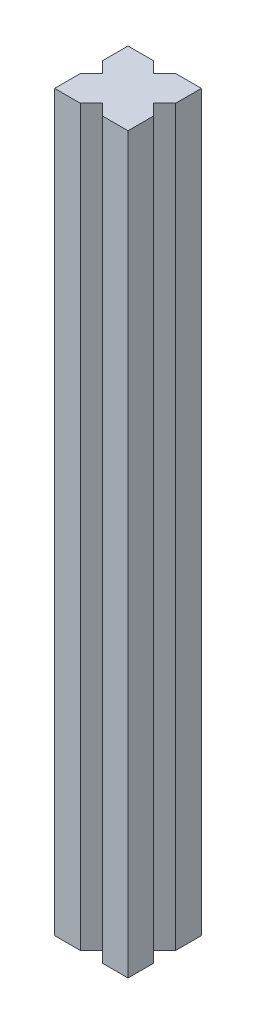
ISO-10303-21;
HEADER;
FILE_DESCRIPTION(('STEP AP214'),'2;1');
FILE_NAME('part.step','',(''),(''),'','','');
FILE_SCHEMA(('AUTOMOTIVE_DESIGN { 1 0 10303 214 1 1 1 1 }'));
ENDSEC;
DATA;
#1=APPLICATION_CONTEXT('core data for automotive mechanical design processes');
#2=APPLICATION_PROTOCOL_DEFINITION('international standard','automotive_design',2000,#1);
#3=PRODUCT_CONTEXT('',#1,'mechanical');
#4=PRODUCT('Part','Part','',(#3));
#5=PRODUCT_RELATED_PRODUCT_CATEGORY('part','',(#4));
#6=PRODUCT_DEFINITION_FORMATION('','',#4);
#7=PRODUCT_DEFINITION_CONTEXT('part definition',#1,'design');
#8=PRODUCT_DEFINITION('design','',#6,#7);
#9=PRODUCT_DEFINITION_SHAPE('','',#8);
#10=(LENGTH_UNIT() NAMED_UNIT(*) SI_UNIT(.MILLI.,.METRE.));
#11=(NAMED_UNIT(*) PLANE_ANGLE_UNIT() SI_UNIT($,.RADIAN.));
#12=(NAMED_UNIT(*) SI_UNIT($,.STERADIAN.) SOLID_ANGLE_UNIT());
#13=UNCERTAINTY_MEASURE_WITH_UNIT(LENGTH_MEASURE(1.E-05),#10,'distance_accuracy_value','');
#14=(GEOMETRIC_REPRESENTATION_CONTEXT(3) GLOBAL_UNCERTAINTY_ASSIGNED_CONTEXT((#13)) GLOBAL_UNIT_ASSIGNED_CONTEXT((#10,
#11,#12)) REPRESENTATION_CONTEXT('',''));
#15=CARTESIAN_POINT('',(0.,0.,0.));
#16=DIRECTION('',(0.,0.,1.));
#17=DIRECTION('',(1.,0.,0.));
#18=AXIS2_PLACEMENT_3D('',#15,#16,#17);
#19=CARTESIAN_POINT('',(0.,200.,0.));
#20=DIRECTION('',(1.,0.,0.));
#21=DIRECTION('',(0.,0.,-1.));
#22=AXIS2_PLACEMENT_3D('',#19,#20,#21);
#23=PLANE('',#22);
#24=DIRECTION('',(0.,0.,1.));
#25=VECTOR('',#24,1.);
#26=CARTESIAN_POINT('',(0.,200.,0.));
#27=LINE('',#26,#25);
#28=CARTESIAN_POINT('',(0.,200.,-7.));
#29=VERTEX_POINT('',#28);
#30=CARTESIAN_POINT('',(0.,200.,0.));
#31=VERTEX_POINT('',#30);
#32=EDGE_CURVE('E188',#29,#31,#27,.T.);
#33=ORIENTED_EDGE('',*,*,#32,.F.);
#34=DIRECTION('',(0.,1.,0.));
#35=VECTOR('',#34,1.);
#36=CARTESIAN_POINT('',(0.,0.,-7.));
#37=LINE('',#36,#35);
#38=CARTESIAN_POINT('',(0.,0.,-7.));
#39=VERTEX_POINT('',#38);
#40=EDGE_CURVE('E239',#39,#29,#37,.T.);
#41=ORIENTED_EDGE('',*,*,#40,.F.);
#42=DIRECTION('',(0.,0.,1.));
#43=VECTOR('',#42,1.);
#44=CARTESIAN_POINT('',(0.,0.,0.));
#45=LINE('',#44,#43);
#46=CARTESIAN_POINT('',(0.,0.,0.));
#47=VERTEX_POINT('',#46);
#48=EDGE_CURVE('E309',#39,#47,#45,.T.);
#49=ORIENTED_EDGE('',*,*,#48,.T.);
#50=DIRECTION('',(0.,-1.,0.));
#51=VECTOR('',#50,1.);
#52=CARTESIAN_POINT('',(0.,200.,0.));
#53=LINE('',#52,#51);
#54=EDGE_CURVE('E11',#31,#47,#53,.T.);
#55=ORIENTED_EDGE('',*,*,#54,.F.);
#56=EDGE_LOOP('',(#33,#41,#49,#55));
#57=FACE_BOUND('',#56,.T.);
#58=ADVANCED_FACE('F40',(#57),#23,.F.);
#59=CARTESIAN_POINT('',(0.,200.,0.));
#60=DIRECTION('',(0.,0.,-1.));
#61=DIRECTION('',(-1.,0.,0.));
#62=AXIS2_PLACEMENT_3D('',#59,#60,#61);
#63=PLANE('',#62);
#64=DIRECTION('',(1.,0.,0.));
#65=VECTOR('',#64,1.);
#66=CARTESIAN_POINT('',(0.,0.,0.));
#67=LINE('',#66,#65);
#68=CARTESIAN_POINT('',(7.,0.,0.));
#69=VERTEX_POINT('',#68);
#70=EDGE_CURVE('E310',#47,#69,#67,.T.);
#71=ORIENTED_EDGE('',*,*,#70,.T.);
#72=DIRECTION('',(0.,1.,0.));
#73=VECTOR('',#72,1.);
#74=CARTESIAN_POINT('',(7.,0.,0.));
#75=LINE('',#74,#73);
#76=CARTESIAN_POINT('',(7.,200.,0.));
#77=VERTEX_POINT('',#76);
#78=EDGE_CURVE('E279',#69,#77,#75,.T.);
#79=ORIENTED_EDGE('',*,*,#78,.T.);
#80=DIRECTION('',(1.,0.,0.));
#81=VECTOR('',#80,1.);
#82=CARTESIAN_POINT('',(0.,200.,0.));
#83=LINE('',#82,#81);
#84=EDGE_CURVE('E298',#31,#77,#83,.T.);
#85=ORIENTED_EDGE('',*,*,#84,.F.);
#86=ORIENTED_EDGE('',*,*,#54,.T.);
#87=EDGE_LOOP('',(#71,#79,#85,#86));
#88=FACE_BOUND('',#87,.T.);
#89=ADVANCED_FACE('F332',(#88),#63,.F.);
#90=CARTESIAN_POINT('',(20.,200.,0.));
#91=DIRECTION('',(-1.,0.,0.));
#92=DIRECTION('',(0.,0.,1.));
#93=AXIS2_PLACEMENT_3D('',#90,#91,#92);
#94=PLANE('',#93);
#95=DIRECTION('',(0.,0.,-1.));
#96=VECTOR('',#95,1.);
#97=CARTESIAN_POINT('',(20.,0.,0.));
#98=LINE('',#97,#96);
#99=CARTESIAN_POINT('',(20.,0.,0.));
#100=VERTEX_POINT('',#99);
#101=CARTESIAN_POINT('',(20.,0.,-7.));
#102=VERTEX_POINT('',#101);
#103=EDGE_CURVE('E181',#100,#102,#98,.T.);
#104=ORIENTED_EDGE('',*,*,#103,.T.);
#105=DIRECTION('',(0.,1.,0.));
#106=VECTOR('',#105,1.);
#107=CARTESIAN_POINT('',(20.,0.,-7.));
#108=LINE('',#107,#106);
#109=CARTESIAN_POINT('',(20.,200.,-7.));
#110=VERTEX_POINT('',#109);
#111=EDGE_CURVE('E242',#102,#110,#108,.T.);
#112=ORIENTED_EDGE('',*,*,#111,.T.);
#113=DIRECTION('',(0.,0.,-1.));
#114=VECTOR('',#113,1.);
#115=CARTESIAN_POINT('',(20.,200.,0.));
#116=LINE('',#115,#114);
#117=CARTESIAN_POINT('',(20.,200.,0.));
#118=VERTEX_POINT('',#117);
#119=EDGE_CURVE('E214',#118,#110,#116,.T.);
#120=ORIENTED_EDGE('',*,*,#119,.F.);
#121=DIRECTION('',(0.,-1.,0.));
#122=VECTOR('',#121,1.);
#123=CARTESIAN_POINT('',(20.,200.,0.));
#124=LINE('',#123,#122);
#125=EDGE_CURVE('E49',#118,#100,#124,.T.);
#126=ORIENTED_EDGE('',*,*,#125,.T.);
#127=EDGE_LOOP('',(#104,#112,#120,#126));
#128=FACE_BOUND('',#127,.T.);
#129=ADVANCED_FACE('F211',(#128),#94,.F.);
#130=CARTESIAN_POINT('',(0.,200.,-20.));
#131=DIRECTION('',(0.,0.,1.));
#132=DIRECTION('',(1.,0.,0.));
#133=AXIS2_PLACEMENT_3D('',#130,#131,#132);
#134=PLANE('',#133);
#135=DIRECTION('',(-1.,0.,0.));
#136=VECTOR('',#135,1.);
#137=CARTESIAN_POINT('',(0.,0.,-20.));
#138=LINE('',#137,#136);
#139=CARTESIAN_POINT('',(20.,0.,-20.));
#140=VERTEX_POINT('',#139);
#141=CARTESIAN_POINT('',(13.,0.,-20.));
#142=VERTEX_POINT('',#141);
#143=EDGE_CURVE('E180',#140,#142,#138,.T.);
#144=ORIENTED_EDGE('',*,*,#143,.T.);
#145=DIRECTION('',(0.,1.,0.));
#146=VECTOR('',#145,1.);
#147=CARTESIAN_POINT('',(13.,0.,-20.));
#148=LINE('',#147,#146);
#149=CARTESIAN_POINT('',(13.,200.,-20.));
#150=VERTEX_POINT('',#149);
#151=EDGE_CURVE('E339',#142,#150,#148,.T.);
#152=ORIENTED_EDGE('',*,*,#151,.T.);
#153=DIRECTION('',(-1.,0.,0.));
#154=VECTOR('',#153,1.);
#155=CARTESIAN_POINT('',(0.,200.,-20.));
#156=LINE('',#155,#154);
#157=CARTESIAN_POINT('',(20.,200.,-20.));
#158=VERTEX_POINT('',#157);
#159=EDGE_CURVE('E199',#158,#150,#156,.T.);
#160=ORIENTED_EDGE('',*,*,#159,.F.);
#161=DIRECTION('',(0.,-1.,0.));
#162=VECTOR('',#161,1.);
#163=CARTESIAN_POINT('',(20.,200.,-20.));
#164=LINE('',#163,#162);
#165=EDGE_CURVE('E198',#158,#140,#164,.T.);
#166=ORIENTED_EDGE('',*,*,#165,.T.);
#167=EDGE_LOOP('',(#144,#152,#160,#166));
#168=FACE_BOUND('',#167,.T.);
#169=ADVANCED_FACE('F355',(#168),#134,.F.);
#170=CARTESIAN_POINT('',(0.,0.,-20.));
#171=VERTEX_POINT('',#170);
#172=CARTESIAN_POINT('',(0.,0.,-13.));
#173=VERTEX_POINT('',#172);
#174=EDGE_CURVE('E178',#171,#173,#45,.T.);
#175=ORIENTED_EDGE('',*,*,#174,.T.);
#176=DIRECTION('',(0.,1.,0.));
#177=VECTOR('',#176,1.);
#178=CARTESIAN_POINT('',(0.,0.,-13.));
#179=LINE('',#178,#177);
#180=CARTESIAN_POINT('',(0.,200.,-13.));
#181=VERTEX_POINT('',#180);
#182=EDGE_CURVE('E266',#173,#181,#179,.T.);
#183=ORIENTED_EDGE('',*,*,#182,.T.);
#184=CARTESIAN_POINT('',(0.,200.,-20.));
#185=VERTEX_POINT('',#184);
#186=EDGE_CURVE('E293',#185,#181,#27,.T.);
#187=ORIENTED_EDGE('',*,*,#186,.F.);
#188=DIRECTION('',(0.,-1.,0.));
#189=VECTOR('',#188,1.);
#190=CARTESIAN_POINT('',(0.,200.,-20.));
#191=LINE('',#190,#189);
#192=EDGE_CURVE('E195',#185,#171,#191,.T.);
#193=ORIENTED_EDGE('',*,*,#192,.T.);
#194=EDGE_LOOP('',(#175,#183,#187,#193));
#195=FACE_BOUND('',#194,.T.);
#196=ADVANCED_FACE('F42',(#195),#23,.F.);
#197=CARTESIAN_POINT('',(13.,200.,0.));
#198=VERTEX_POINT('',#197);
#199=EDGE_CURVE('E297',#198,#118,#83,.T.);
#200=ORIENTED_EDGE('',*,*,#199,.F.);
#201=DIRECTION('',(0.,1.,0.));
#202=VECTOR('',#201,1.);
#203=CARTESIAN_POINT('',(13.,0.,0.));
#204=LINE('',#203,#202);
#205=CARTESIAN_POINT('',(13.,0.,0.));
#206=VERTEX_POINT('',#205);
#207=EDGE_CURVE('E287',#206,#198,#204,.T.);
#208=ORIENTED_EDGE('',*,*,#207,.F.);
#209=EDGE_CURVE('E219',#206,#100,#67,.T.);
#210=ORIENTED_EDGE('',*,*,#209,.T.);
#211=ORIENTED_EDGE('',*,*,#125,.F.);
#212=EDGE_LOOP('',(#200,#208,#210,#211));
#213=FACE_BOUND('',#212,.T.);
#214=ADVANCED_FACE('F321',(#213),#63,.F.);
#215=CARTESIAN_POINT('',(20.,200.,-13.));
#216=VERTEX_POINT('',#215);
#217=EDGE_CURVE('E302',#216,#158,#116,.T.);
#218=ORIENTED_EDGE('',*,*,#217,.F.);
#219=DIRECTION('',(0.,1.,0.));
#220=VECTOR('',#219,1.);
#221=CARTESIAN_POINT('',(20.,0.,-13.));
#222=LINE('',#221,#220);
#223=CARTESIAN_POINT('',(20.,0.,-13.));
#224=VERTEX_POINT('',#223);
#225=EDGE_CURVE('E224',#224,#216,#222,.T.);
#226=ORIENTED_EDGE('',*,*,#225,.F.);
#227=EDGE_CURVE('E191',#224,#140,#98,.T.);
#228=ORIENTED_EDGE('',*,*,#227,.T.);
#229=ORIENTED_EDGE('',*,*,#165,.F.);
#230=EDGE_LOOP('',(#218,#226,#228,#229));
#231=FACE_BOUND('',#230,.T.);
#232=ADVANCED_FACE('F359',(#231),#94,.F.);
#233=CARTESIAN_POINT('',(7.,200.,-20.));
#234=VERTEX_POINT('',#233);
#235=EDGE_CURVE('E171',#234,#185,#156,.T.);
#236=ORIENTED_EDGE('',*,*,#235,.F.);
#237=DIRECTION('',(0.,1.,0.));
#238=VECTOR('',#237,1.);
#239=CARTESIAN_POINT('',(7.,0.,-20.));
#240=LINE('',#239,#238);
#241=CARTESIAN_POINT('',(7.,0.,-20.));
#242=VERTEX_POINT('',#241);
#243=EDGE_CURVE('E157',#242,#234,#240,.T.);
#244=ORIENTED_EDGE('',*,*,#243,.F.);
#245=EDGE_CURVE('E169',#242,#171,#138,.T.);
#246=ORIENTED_EDGE('',*,*,#245,.T.);
#247=ORIENTED_EDGE('',*,*,#192,.F.);
#248=EDGE_LOOP('',(#236,#244,#246,#247));
#249=FACE_BOUND('',#248,.T.);
#250=ADVANCED_FACE('F167',(#249),#134,.F.);
#251=CARTESIAN_POINT('',(0.,200.,0.));
#252=DIRECTION('',(0.,-1.,0.));
#253=DIRECTION('',(0.,0.,-1.));
#254=AXIS2_PLACEMENT_3D('',#251,#252,#253);
#255=PLANE('',#254);
#256=ORIENTED_EDGE('',*,*,#159,.T.);
#257=DIRECTION('',(0.707106781186548,0.,-0.707106781186547));
#258=VECTOR('',#257,1.);
#259=CARTESIAN_POINT('',(13.,200.,-20.));
#260=LINE('',#259,#258);
#261=CARTESIAN_POINT('',(10.,200.,-17.));
#262=VERTEX_POINT('',#261);
#263=EDGE_CURVE('E163',#262,#150,#260,.T.);
#264=ORIENTED_EDGE('',*,*,#263,.F.);
#265=DIRECTION('',(0.707106781186548,0.,0.707106781186547));
#266=VECTOR('',#265,1.);
#267=CARTESIAN_POINT('',(7.,200.,-20.));
#268=LINE('',#267,#266);
#269=EDGE_CURVE('E245',#234,#262,#268,.T.);
#270=ORIENTED_EDGE('',*,*,#269,.F.);
#271=ORIENTED_EDGE('',*,*,#235,.T.);
#272=ORIENTED_EDGE('',*,*,#186,.T.);
#273=DIRECTION('',(-0.707106781186547,0.,-0.707106781186548));
#274=VECTOR('',#273,1.);
#275=CARTESIAN_POINT('',(0.,200.,-13.));
#276=LINE('',#275,#274);
#277=CARTESIAN_POINT('',(2.99999999999999,200.,-10.));
#278=VERTEX_POINT('',#277);
#279=EDGE_CURVE('E253',#278,#181,#276,.T.);
#280=ORIENTED_EDGE('',*,*,#279,.F.);
#281=DIRECTION('',(0.707106781186548,0.,-0.707106781186547));
#282=VECTOR('',#281,1.);
#283=CARTESIAN_POINT('',(0.,200.,-7.));
#284=LINE('',#283,#282);
#285=EDGE_CURVE('E257',#29,#278,#284,.T.);
#286=ORIENTED_EDGE('',*,*,#285,.F.);
#287=ORIENTED_EDGE('',*,*,#32,.T.);
#288=ORIENTED_EDGE('',*,*,#84,.T.);
#289=DIRECTION('',(-0.707106781186547,0.,0.707106781186548));
#290=VECTOR('',#289,1.);
#291=CARTESIAN_POINT('',(7.,200.,0.));
#292=LINE('',#291,#290);
#293=CARTESIAN_POINT('',(10.,200.,-3.));
#294=VERTEX_POINT('',#293);
#295=EDGE_CURVE('E280',#294,#77,#292,.T.);
#296=ORIENTED_EDGE('',*,*,#295,.F.);
#297=DIRECTION('',(-0.707106781186547,0.,-0.707106781186548));
#298=VECTOR('',#297,1.);
#299=CARTESIAN_POINT('',(13.,200.,0.));
#300=LINE('',#299,#298);
#301=EDGE_CURVE('E276',#198,#294,#300,.T.);
#302=ORIENTED_EDGE('',*,*,#301,.F.);
#303=ORIENTED_EDGE('',*,*,#199,.T.);
#304=ORIENTED_EDGE('',*,*,#119,.T.);
#305=DIRECTION('',(0.707106781186548,0.,0.707106781186547));
#306=VECTOR('',#305,1.);
#307=CARTESIAN_POINT('',(20.,200.,-7.));
#308=LINE('',#307,#306);
#309=CARTESIAN_POINT('',(17.,200.,-10.));
#310=VERTEX_POINT('',#309);
#311=EDGE_CURVE('E232',#310,#110,#308,.T.);
#312=ORIENTED_EDGE('',*,*,#311,.F.);
#313=DIRECTION('',(-0.707106781186547,0.,0.707106781186548));
#314=VECTOR('',#313,1.);
#315=CARTESIAN_POINT('',(20.,200.,-13.));
#316=LINE('',#315,#314);
#317=EDGE_CURVE('E235',#216,#310,#316,.T.);
#318=ORIENTED_EDGE('',*,*,#317,.F.);
#319=ORIENTED_EDGE('',*,*,#217,.T.);
#320=EDGE_LOOP('',(#256,#264,#270,#271,#272,#280,#286,#287,#288,#296,#302,#303,#304,#312,#318,#319));
#321=FACE_BOUND('',#320,.T.);
#322=ADVANCED_FACE('F328',(#321),#255,.F.);
#323=CARTESIAN_POINT('',(0.,0.,0.));
#324=DIRECTION('',(0.,-1.,0.));
#325=DIRECTION('',(0.,0.,-1.));
#326=AXIS2_PLACEMENT_3D('',#323,#324,#325);
#327=PLANE('',#326);
#328=DIRECTION('',(0.707106781186548,0.,-0.707106781186547));
#329=VECTOR('',#328,1.);
#330=CARTESIAN_POINT('',(13.,0.,-20.));
#331=LINE('',#330,#329);
#332=CARTESIAN_POINT('',(10.,0.,-17.));
#333=VERTEX_POINT('',#332);
#334=EDGE_CURVE('E56',#333,#142,#331,.T.);
#335=ORIENTED_EDGE('',*,*,#334,.T.);
#336=ORIENTED_EDGE('',*,*,#143,.F.);
#337=ORIENTED_EDGE('',*,*,#227,.F.);
#338=DIRECTION('',(-0.707106781186547,0.,0.707106781186548));
#339=VECTOR('',#338,1.);
#340=CARTESIAN_POINT('',(20.,0.,-13.));
#341=LINE('',#340,#339);
#342=CARTESIAN_POINT('',(17.,0.,-10.));
#343=VERTEX_POINT('',#342);
#344=EDGE_CURVE('E222',#224,#343,#341,.T.);
#345=ORIENTED_EDGE('',*,*,#344,.T.);
#346=DIRECTION('',(0.707106781186548,0.,0.707106781186547));
#347=VECTOR('',#346,1.);
#348=CARTESIAN_POINT('',(20.,0.,-7.));
#349=LINE('',#348,#347);
#350=EDGE_CURVE('E64',#343,#102,#349,.T.);
#351=ORIENTED_EDGE('',*,*,#350,.T.);
#352=ORIENTED_EDGE('',*,*,#103,.F.);
#353=ORIENTED_EDGE('',*,*,#209,.F.);
#354=DIRECTION('',(-0.707106781186547,0.,-0.707106781186548));
#355=VECTOR('',#354,1.);
#356=CARTESIAN_POINT('',(13.,0.,0.));
#357=LINE('',#356,#355);
#358=CARTESIAN_POINT('',(10.,0.,-3.));
#359=VERTEX_POINT('',#358);
#360=EDGE_CURVE('E275',#206,#359,#357,.T.);
#361=ORIENTED_EDGE('',*,*,#360,.T.);
#362=DIRECTION('',(-0.707106781186547,0.,0.707106781186548));
#363=VECTOR('',#362,1.);
#364=CARTESIAN_POINT('',(7.,0.,0.));
#365=LINE('',#364,#363);
#366=EDGE_CURVE('E271',#359,#69,#365,.T.);
#367=ORIENTED_EDGE('',*,*,#366,.T.);
#368=ORIENTED_EDGE('',*,*,#70,.F.);
#369=ORIENTED_EDGE('',*,*,#48,.F.);
#370=DIRECTION('',(0.707106781186548,0.,-0.707106781186547));
#371=VECTOR('',#370,1.);
#372=CARTESIAN_POINT('',(0.,0.,-7.));
#373=LINE('',#372,#371);
#374=CARTESIAN_POINT('',(2.99999999999999,0.,-10.));
#375=VERTEX_POINT('',#374);
#376=EDGE_CURVE('E248',#39,#375,#373,.T.);
#377=ORIENTED_EDGE('',*,*,#376,.T.);
#378=DIRECTION('',(-0.707106781186547,0.,-0.707106781186548));
#379=VECTOR('',#378,1.);
#380=CARTESIAN_POINT('',(0.,0.,-13.));
#381=LINE('',#380,#379);
#382=EDGE_CURVE('E252',#375,#173,#381,.T.);
#383=ORIENTED_EDGE('',*,*,#382,.T.);
#384=ORIENTED_EDGE('',*,*,#174,.F.);
#385=ORIENTED_EDGE('',*,*,#245,.F.);
#386=DIRECTION('',(0.707106781186548,0.,0.707106781186547));
#387=VECTOR('',#386,1.);
#388=CARTESIAN_POINT('',(7.,0.,-20.));
#389=LINE('',#388,#387);
#390=EDGE_CURVE('E153',#242,#333,#389,.T.);
#391=ORIENTED_EDGE('',*,*,#390,.T.);
#392=EDGE_LOOP('',(#335,#336,#337,#345,#351,#352,#353,#361,#367,#368,#369,#377,#383,#384,#385,#391));
#393=FACE_BOUND('',#392,.T.);
#394=ADVANCED_FACE('F175',(#393),#327,.T.);
#395=CARTESIAN_POINT('',(7.,0.,0.));
#396=DIRECTION('',(-0.707106781186548,0.,-0.707106781186547));
#397=DIRECTION('',(-0.707106781186547,0.,0.707106781186548));
#398=AXIS2_PLACEMENT_3D('',#395,#396,#397);
#399=PLANE('',#398);
#400=ORIENTED_EDGE('',*,*,#295,.T.);
#401=ORIENTED_EDGE('',*,*,#78,.F.);
#402=ORIENTED_EDGE('',*,*,#366,.F.);
#403=DIRECTION('',(0.,1.,0.));
#404=VECTOR('',#403,1.);
#405=CARTESIAN_POINT('',(10.,0.,-3.));
#406=LINE('',#405,#404);
#407=EDGE_CURVE('E261',#359,#294,#406,.T.);
#408=ORIENTED_EDGE('',*,*,#407,.T.);
#409=EDGE_LOOP('',(#400,#401,#402,#408));
#410=FACE_BOUND('',#409,.T.);
#411=ADVANCED_FACE('F331',(#410),#399,.F.);
#412=CARTESIAN_POINT('',(13.,0.,0.));
#413=DIRECTION('',(0.707106781186548,0.,-0.707106781186547));
#414=DIRECTION('',(-0.707106781186547,0.,-0.707106781186548));
#415=AXIS2_PLACEMENT_3D('',#412,#413,#414);
#416=PLANE('',#415);
#417=ORIENTED_EDGE('',*,*,#301,.T.);
#418=ORIENTED_EDGE('',*,*,#407,.F.);
#419=ORIENTED_EDGE('',*,*,#360,.F.);
#420=ORIENTED_EDGE('',*,*,#207,.T.);
#421=EDGE_LOOP('',(#417,#418,#419,#420));
#422=FACE_BOUND('',#421,.T.);
#423=ADVANCED_FACE('F324',(#422),#416,.F.);
#424=CARTESIAN_POINT('',(0.,0.,-7.));
#425=DIRECTION('',(0.707106781186547,0.,0.707106781186548));
#426=DIRECTION('',(0.707106781186548,0.,-0.707106781186547));
#427=AXIS2_PLACEMENT_3D('',#424,#425,#426);
#428=PLANE('',#427);
#429=ORIENTED_EDGE('',*,*,#285,.T.);
#430=DIRECTION('',(0.,1.,0.));
#431=VECTOR('',#430,1.);
#432=CARTESIAN_POINT('',(2.99999999999999,0.,-10.));
#433=LINE('',#432,#431);
#434=EDGE_CURVE('E256',#375,#278,#433,.T.);
#435=ORIENTED_EDGE('',*,*,#434,.F.);
#436=ORIENTED_EDGE('',*,*,#376,.F.);
#437=ORIENTED_EDGE('',*,*,#40,.T.);
#438=EDGE_LOOP('',(#429,#435,#436,#437));
#439=FACE_BOUND('',#438,.T.);
#440=ADVANCED_FACE('F375',(#439),#428,.F.);
#441=CARTESIAN_POINT('',(0.,0.,-13.));
#442=DIRECTION('',(0.707106781186548,0.,-0.707106781186547));
#443=DIRECTION('',(-0.707106781186547,0.,-0.707106781186548));
#444=AXIS2_PLACEMENT_3D('',#441,#442,#443);
#445=PLANE('',#444);
#446=ORIENTED_EDGE('',*,*,#279,.T.);
#447=ORIENTED_EDGE('',*,*,#182,.F.);
#448=ORIENTED_EDGE('',*,*,#382,.F.);
#449=ORIENTED_EDGE('',*,*,#434,.T.);
#450=EDGE_LOOP('',(#446,#447,#448,#449));
#451=FACE_BOUND('',#450,.T.);
#452=ADVANCED_FACE('F367',(#451),#445,.F.);
#453=CARTESIAN_POINT('',(20.,0.,-7.));
#454=DIRECTION('',(-0.707106781186547,0.,0.707106781186548));
#455=DIRECTION('',(0.707106781186548,0.,0.707106781186547));
#456=AXIS2_PLACEMENT_3D('',#453,#454,#455);
#457=PLANE('',#456);
#458=ORIENTED_EDGE('',*,*,#311,.T.);
#459=ORIENTED_EDGE('',*,*,#111,.F.);
#460=ORIENTED_EDGE('',*,*,#350,.F.);
#461=DIRECTION('',(0.,1.,0.));
#462=VECTOR('',#461,1.);
#463=CARTESIAN_POINT('',(17.,0.,-10.));
#464=LINE('',#463,#462);
#465=EDGE_CURVE('E229',#343,#310,#464,.T.);
#466=ORIENTED_EDGE('',*,*,#465,.T.);
#467=EDGE_LOOP('',(#458,#459,#460,#466));
#468=FACE_BOUND('',#467,.T.);
#469=ADVANCED_FACE('F365',(#468),#457,.F.);
#470=CARTESIAN_POINT('',(20.,0.,-13.));
#471=DIRECTION('',(-0.707106781186548,0.,-0.707106781186547));
#472=DIRECTION('',(-0.707106781186547,0.,0.707106781186548));
#473=AXIS2_PLACEMENT_3D('',#470,#471,#472);
#474=PLANE('',#473);
#475=ORIENTED_EDGE('',*,*,#317,.T.);
#476=ORIENTED_EDGE('',*,*,#465,.F.);
#477=ORIENTED_EDGE('',*,*,#344,.F.);
#478=ORIENTED_EDGE('',*,*,#225,.T.);
#479=EDGE_LOOP('',(#475,#476,#477,#478));
#480=FACE_BOUND('',#479,.T.);
#481=ADVANCED_FACE('F363',(#480),#474,.F.);
#482=CARTESIAN_POINT('',(13.,0.,-20.));
#483=DIRECTION('',(0.707106781186547,0.,0.707106781186548));
#484=DIRECTION('',(0.707106781186548,0.,-0.707106781186547));
#485=AXIS2_PLACEMENT_3D('',#482,#483,#484);
#486=PLANE('',#485);
#487=ORIENTED_EDGE('',*,*,#263,.T.);
#488=ORIENTED_EDGE('',*,*,#151,.F.);
#489=ORIENTED_EDGE('',*,*,#334,.F.);
#490=DIRECTION('',(0.,1.,0.));
#491=VECTOR('',#490,1.);
#492=CARTESIAN_POINT('',(10.,0.,-17.));
#493=LINE('',#492,#491);
#494=EDGE_CURVE('E159',#333,#262,#493,.T.);
#495=ORIENTED_EDGE('',*,*,#494,.T.);
#496=EDGE_LOOP('',(#487,#488,#489,#495));
#497=FACE_BOUND('',#496,.T.);
#498=ADVANCED_FACE('F373',(#497),#486,.F.);
#499=CARTESIAN_POINT('',(7.,0.,-20.));
#500=DIRECTION('',(-0.707106781186547,0.,0.707106781186548));
#501=DIRECTION('',(0.707106781186548,0.,0.707106781186547));
#502=AXIS2_PLACEMENT_3D('',#499,#500,#501);
#503=PLANE('',#502);
#504=ORIENTED_EDGE('',*,*,#269,.T.);
#505=ORIENTED_EDGE('',*,*,#494,.F.);
#506=ORIENTED_EDGE('',*,*,#390,.F.);
#507=ORIENTED_EDGE('',*,*,#243,.T.);
#508=EDGE_LOOP('',(#504,#505,#506,#507));
#509=FACE_BOUND('',#508,.T.);
#510=ADVANCED_FACE('F156',(#509),#503,.F.);
#511=CLOSED_SHELL('',(#58,#89,#129,#169,#196,#214,#232,#250,#322,#394,#411,#423,#440,#452,#469,
#481,#498,#510));
#512=MANIFOLD_SOLID_BREP('B2',#511);
#513=ADVANCED_BREP_SHAPE_REPRESENTATION('',(#18,#512),#14);
#514=SHAPE_DEFINITION_REPRESENTATION(#9,#513);
ENDSEC;
END-ISO-10303-21;
